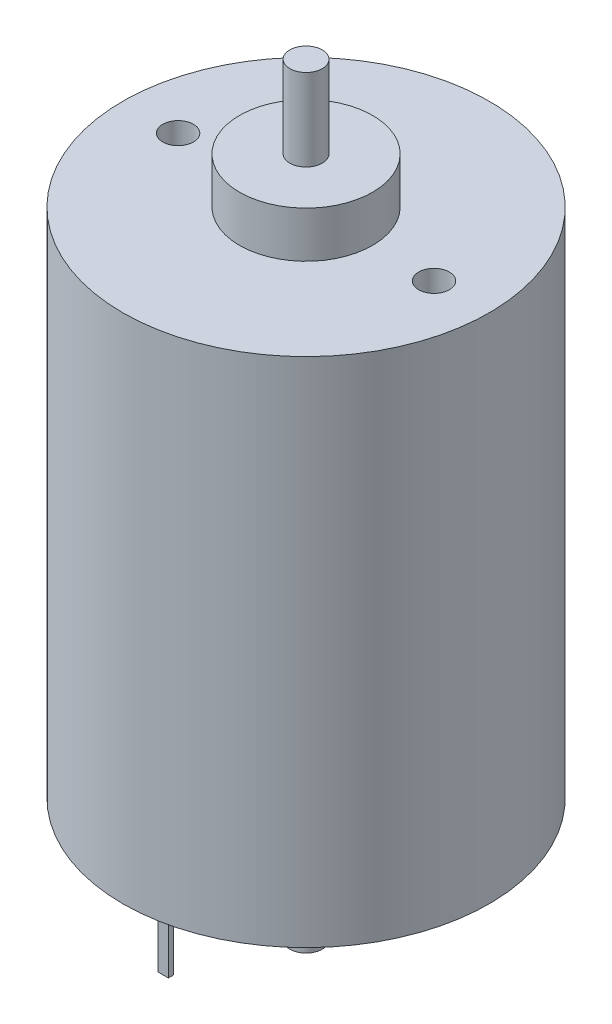
ISO-10303-21;
HEADER;
FILE_DESCRIPTION(('STEP AP214'),'2;1');
FILE_NAME('part.step','',(''),(''),'','','');
FILE_SCHEMA(('AUTOMOTIVE_DESIGN { 1 0 10303 214 1 1 1 1 }'));
ENDSEC;
DATA;
#1=APPLICATION_CONTEXT('core data for automotive mechanical design processes');
#2=APPLICATION_PROTOCOL_DEFINITION('international standard','automotive_design',2000,#1);
#3=PRODUCT_CONTEXT('',#1,'mechanical');
#4=PRODUCT('Part','Part','',(#3));
#5=PRODUCT_RELATED_PRODUCT_CATEGORY('part','',(#4));
#6=PRODUCT_DEFINITION_FORMATION('','',#4);
#7=PRODUCT_DEFINITION_CONTEXT('part definition',#1,'design');
#8=PRODUCT_DEFINITION('design','',#6,#7);
#9=PRODUCT_DEFINITION_SHAPE('','',#8);
#10=(LENGTH_UNIT() NAMED_UNIT(*) SI_UNIT(.MILLI.,.METRE.));
#11=(NAMED_UNIT(*) PLANE_ANGLE_UNIT() SI_UNIT($,.RADIAN.));
#12=(NAMED_UNIT(*) SI_UNIT($,.STERADIAN.) SOLID_ANGLE_UNIT());
#13=UNCERTAINTY_MEASURE_WITH_UNIT(LENGTH_MEASURE(1.E-05),#10,'distance_accuracy_value','');
#14=(GEOMETRIC_REPRESENTATION_CONTEXT(3) GLOBAL_UNCERTAINTY_ASSIGNED_CONTEXT((#13)) GLOBAL_UNIT_ASSIGNED_CONTEXT((#10,
#11,#12)) REPRESENTATION_CONTEXT('',''));
#15=CARTESIAN_POINT('',(0.,0.,0.));
#16=DIRECTION('',(0.,0.,1.));
#17=DIRECTION('',(1.,0.,0.));
#18=AXIS2_PLACEMENT_3D('',#15,#16,#17);
#19=CARTESIAN_POINT('',(0.,-15.5,0.));
#20=DIRECTION('',(0.,1.,0.));
#21=DIRECTION('',(0.,0.,1.));
#22=AXIS2_PLACEMENT_3D('',#19,#20,#21);
#23=CYLINDRICAL_SURFACE('',#22,1.585);
#24=CARTESIAN_POINT('',(0.,-3.,0.));
#25=DIRECTION('',(0.,-1.,0.));
#26=DIRECTION('',(0.,0.,-1.));
#27=AXIS2_PLACEMENT_3D('',#24,#25,#26);
#28=CIRCLE('',#27,1.585);
#29=CARTESIAN_POINT('',(0.,-3.,-1.585));
#30=VERTEX_POINT('',#29);
#31=EDGE_CURVE('E179',#30,#30,#28,.T.);
#32=ORIENTED_EDGE('',*,*,#31,.T.);
#33=EDGE_LOOP('',(#32));
#34=FACE_BOUND('',#33,.T.);
#35=CARTESIAN_POINT('',(0.,-12.,0.));
#36=DIRECTION('',(0.,-1.,0.));
#37=DIRECTION('',(0.,0.,-1.));
#38=AXIS2_PLACEMENT_3D('',#35,#36,#37);
#39=CIRCLE('',#38,1.585);
#40=CARTESIAN_POINT('',(0.,-12.,-1.585));
#41=VERTEX_POINT('',#40);
#42=EDGE_CURVE('E287',#41,#41,#39,.T.);
#43=ORIENTED_EDGE('',*,*,#42,.F.);
#44=EDGE_LOOP('',(#43));
#45=FACE_BOUND('',#44,.T.);
#46=ADVANCED_FACE('F42',(#34,#45),#23,.T.);
#47=CARTESIAN_POINT('',(0.,67.,0.));
#48=DIRECTION('',(0.,-1.,0.));
#49=DIRECTION('',(0.,0.,-1.));
#50=AXIS2_PLACEMENT_3D('',#47,#48,#49);
#51=CYLINDRICAL_SURFACE('',#50,1.585);
#52=CARTESIAN_POINT('',(0.,54.5,0.));
#53=DIRECTION('',(0.,1.,0.));
#54=DIRECTION('',(0.,0.,1.));
#55=AXIS2_PLACEMENT_3D('',#52,#53,#54);
#56=CIRCLE('',#55,1.585);
#57=CARTESIAN_POINT('',(0.,54.5,1.585));
#58=VERTEX_POINT('',#57);
#59=EDGE_CURVE('E185',#58,#58,#56,.T.);
#60=ORIENTED_EDGE('',*,*,#59,.T.);
#61=EDGE_LOOP('',(#60));
#62=FACE_BOUND('',#61,.T.);
#63=CARTESIAN_POINT('',(0.,62.5,0.));
#64=DIRECTION('',(0.,1.,0.));
#65=DIRECTION('',(0.,0.,1.));
#66=AXIS2_PLACEMENT_3D('',#63,#64,#65);
#67=CIRCLE('',#66,1.585);
#68=CARTESIAN_POINT('',(0.,62.5,1.585));
#69=VERTEX_POINT('',#68);
#70=EDGE_CURVE('E283',#69,#69,#67,.T.);
#71=ORIENTED_EDGE('',*,*,#70,.F.);
#72=EDGE_LOOP('',(#71));
#73=FACE_BOUND('',#72,.T.);
#74=ADVANCED_FACE('F203',(#62,#73),#51,.T.);
#75=CARTESIAN_POINT('',(0.,0.,0.));
#76=DIRECTION('',(0.,1.,0.));
#77=DIRECTION('',(0.,0.,1.));
#78=AXIS2_PLACEMENT_3D('',#75,#76,#77);
#79=PLANE('',#78);
#80=DIRECTION('',(0.,0.,-1.));
#81=VECTOR('',#80,1.);
#82=CARTESIAN_POINT('',(0.499999999999986,0.,0.));
#83=LINE('',#82,#81);
#84=CARTESIAN_POINT('',(0.499999999999986,0.,13.95));
#85=VERTEX_POINT('',#84);
#86=CARTESIAN_POINT('',(0.499999999999986,0.,13.45));
#87=VERTEX_POINT('',#86);
#88=EDGE_CURVE('E140',#85,#87,#83,.T.);
#89=ORIENTED_EDGE('',*,*,#88,.T.);
#90=DIRECTION('',(-1.,0.,0.));
#91=VECTOR('',#90,1.);
#92=CARTESIAN_POINT('',(0.,0.,13.45));
#93=LINE('',#92,#91);
#94=CARTESIAN_POINT('',(-0.500000000000014,0.,13.45));
#95=VERTEX_POINT('',#94);
#96=EDGE_CURVE('E113',#87,#95,#93,.T.);
#97=ORIENTED_EDGE('',*,*,#96,.T.);
#98=DIRECTION('',(0.,0.,1.));
#99=VECTOR('',#98,1.);
#100=CARTESIAN_POINT('',(-0.500000000000014,0.,0.));
#101=LINE('',#100,#99);
#102=CARTESIAN_POINT('',(-0.500000000000014,0.,13.95));
#103=VERTEX_POINT('',#102);
#104=EDGE_CURVE('E129',#95,#103,#101,.T.);
#105=ORIENTED_EDGE('',*,*,#104,.T.);
#106=DIRECTION('',(1.,0.,0.));
#107=VECTOR('',#106,1.);
#108=CARTESIAN_POINT('',(0.,0.,13.95));
#109=LINE('',#108,#107);
#110=EDGE_CURVE('E57',#103,#85,#109,.T.);
#111=ORIENTED_EDGE('',*,*,#110,.T.);
#112=EDGE_LOOP('',(#89,#97,#105,#111));
#113=FACE_BOUND('',#112,.T.);
#114=CARTESIAN_POINT('',(0.,0.,0.));
#115=DIRECTION('',(0.,1.,0.));
#116=DIRECTION('',(0.,0.,1.));
#117=AXIS2_PLACEMENT_3D('',#114,#115,#116);
#118=CIRCLE('',#117,17.9);
#119=CARTESIAN_POINT('',(0.,0.,17.9));
#120=VERTEX_POINT('',#119);
#121=EDGE_CURVE('E192',#120,#120,#118,.T.);
#122=ORIENTED_EDGE('',*,*,#121,.F.);
#123=EDGE_LOOP('',(#122));
#124=FACE_BOUND('',#123,.T.);
#125=CARTESIAN_POINT('',(0.,0.,0.));
#126=DIRECTION('',(0.,1.,0.));
#127=DIRECTION('',(0.,0.,1.));
#128=AXIS2_PLACEMENT_3D('',#125,#126,#127);
#129=CIRCLE('',#128,5.1);
#130=CARTESIAN_POINT('',(0.,0.,5.1));
#131=VERTEX_POINT('',#130);
#132=EDGE_CURVE('E11',#131,#131,#129,.F.);
#133=ORIENTED_EDGE('',*,*,#132,.F.);
#134=EDGE_LOOP('',(#133));
#135=FACE_BOUND('',#134,.T.);
#136=DIRECTION('',(-1.,0.,0.));
#137=VECTOR('',#136,1.);
#138=CARTESIAN_POINT('',(0.,0.,-13.45));
#139=LINE('',#138,#137);
#140=CARTESIAN_POINT('',(0.5,0.,-13.45));
#141=VERTEX_POINT('',#140);
#142=CARTESIAN_POINT('',(-0.5,0.,-13.45));
#143=VERTEX_POINT('',#142);
#144=EDGE_CURVE('E118',#141,#143,#139,.T.);
#145=ORIENTED_EDGE('',*,*,#144,.F.);
#146=DIRECTION('',(0.,0.,1.));
#147=VECTOR('',#146,1.);
#148=CARTESIAN_POINT('',(0.5,0.,0.));
#149=LINE('',#148,#147);
#150=CARTESIAN_POINT('',(0.5,0.,-13.95));
#151=VERTEX_POINT('',#150);
#152=EDGE_CURVE('E154',#151,#141,#149,.T.);
#153=ORIENTED_EDGE('',*,*,#152,.F.);
#154=DIRECTION('',(-1.,0.,0.));
#155=VECTOR('',#154,1.);
#156=CARTESIAN_POINT('',(0.,0.,-13.95));
#157=LINE('',#156,#155);
#158=CARTESIAN_POINT('',(-0.5,0.,-13.95));
#159=VERTEX_POINT('',#158);
#160=EDGE_CURVE('E165',#151,#159,#157,.T.);
#161=ORIENTED_EDGE('',*,*,#160,.T.);
#162=DIRECTION('',(0.,0.,-1.));
#163=VECTOR('',#162,1.);
#164=CARTESIAN_POINT('',(-0.5,0.,0.));
#165=LINE('',#164,#163);
#166=EDGE_CURVE('E65',#143,#159,#165,.T.);
#167=ORIENTED_EDGE('',*,*,#166,.F.);
#168=EDGE_LOOP('',(#145,#153,#161,#167));
#169=FACE_BOUND('',#168,.T.);
#170=ADVANCED_FACE('F200',(#113,#124,#135,#169),#79,.F.);
#171=CARTESIAN_POINT('',(0.,50.,0.));
#172=DIRECTION('',(0.,-1.,0.));
#173=DIRECTION('',(0.,0.,-1.));
#174=AXIS2_PLACEMENT_3D('',#171,#172,#173);
#175=CYLINDRICAL_SURFACE('',#174,17.9);
#176=CARTESIAN_POINT('',(0.,50.,0.));
#177=DIRECTION('',(0.,1.,0.));
#178=DIRECTION('',(0.,0.,1.));
#179=AXIS2_PLACEMENT_3D('',#176,#177,#178);
#180=CIRCLE('',#179,17.9);
#181=CARTESIAN_POINT('',(0.,50.,17.9));
#182=VERTEX_POINT('',#181);
#183=EDGE_CURVE('E50',#182,#182,#180,.T.);
#184=ORIENTED_EDGE('',*,*,#183,.F.);
#185=EDGE_LOOP('',(#184));
#186=FACE_BOUND('',#185,.T.);
#187=ORIENTED_EDGE('',*,*,#121,.T.);
#188=EDGE_LOOP('',(#187));
#189=FACE_BOUND('',#188,.T.);
#190=ADVANCED_FACE('F44',(#186,#189),#175,.T.);
#191=CARTESIAN_POINT('',(0.,50.,0.));
#192=DIRECTION('',(0.,1.,0.));
#193=DIRECTION('',(0.,0.,1.));
#194=AXIS2_PLACEMENT_3D('',#191,#192,#193);
#195=PLANE('',#194);
#196=CARTESIAN_POINT('',(-12.5,50.,0.));
#197=DIRECTION('',(0.,1.,0.));
#198=DIRECTION('',(0.,0.,1.));
#199=AXIS2_PLACEMENT_3D('',#196,#197,#198);
#200=CIRCLE('',#199,1.5);
#201=CARTESIAN_POINT('',(-12.5,50.,1.5));
#202=VERTEX_POINT('',#201);
#203=EDGE_CURVE('E267',#202,#202,#200,.T.);
#204=ORIENTED_EDGE('',*,*,#203,.F.);
#205=EDGE_LOOP('',(#204));
#206=FACE_BOUND('',#205,.T.);
#207=CARTESIAN_POINT('',(12.5,50.,0.));
#208=DIRECTION('',(0.,1.,0.));
#209=DIRECTION('',(0.,0.,1.));
#210=AXIS2_PLACEMENT_3D('',#207,#208,#209);
#211=CIRCLE('',#210,1.5);
#212=CARTESIAN_POINT('',(12.5,50.,1.5));
#213=VERTEX_POINT('',#212);
#214=EDGE_CURVE('E271',#213,#213,#211,.T.);
#215=ORIENTED_EDGE('',*,*,#214,.F.);
#216=EDGE_LOOP('',(#215));
#217=FACE_BOUND('',#216,.T.);
#218=CARTESIAN_POINT('',(0.,50.,0.));
#219=DIRECTION('',(0.,1.,0.));
#220=DIRECTION('',(0.,0.,1.));
#221=AXIS2_PLACEMENT_3D('',#218,#219,#220);
#222=CIRCLE('',#221,6.5);
#223=CARTESIAN_POINT('',(0.,50.,6.5));
#224=VERTEX_POINT('',#223);
#225=EDGE_CURVE('E188',#224,#224,#222,.T.);
#226=ORIENTED_EDGE('',*,*,#225,.F.);
#227=EDGE_LOOP('',(#226));
#228=FACE_BOUND('',#227,.T.);
#229=ORIENTED_EDGE('',*,*,#183,.T.);
#230=EDGE_LOOP('',(#229));
#231=FACE_BOUND('',#230,.T.);
#232=ADVANCED_FACE('F256',(#206,#217,#228,#231),#195,.T.);
#233=CARTESIAN_POINT('',(0.,54.5,0.));
#234=DIRECTION('',(0.,-1.,0.));
#235=DIRECTION('',(0.,0.,-1.));
#236=AXIS2_PLACEMENT_3D('',#233,#234,#235);
#237=CYLINDRICAL_SURFACE('',#236,6.5);
#238=CARTESIAN_POINT('',(0.,54.5,0.));
#239=DIRECTION('',(0.,1.,0.));
#240=DIRECTION('',(0.,0.,1.));
#241=AXIS2_PLACEMENT_3D('',#238,#239,#240);
#242=CIRCLE('',#241,6.5);
#243=CARTESIAN_POINT('',(0.,54.5,6.5));
#244=VERTEX_POINT('',#243);
#245=EDGE_CURVE('E189',#244,#244,#242,.T.);
#246=ORIENTED_EDGE('',*,*,#245,.F.);
#247=EDGE_LOOP('',(#246));
#248=FACE_BOUND('',#247,.T.);
#249=ORIENTED_EDGE('',*,*,#225,.T.);
#250=EDGE_LOOP('',(#249));
#251=FACE_BOUND('',#250,.T.);
#252=ADVANCED_FACE('F252',(#248,#251),#237,.T.);
#253=CARTESIAN_POINT('',(0.,54.5,0.));
#254=DIRECTION('',(0.,1.,0.));
#255=DIRECTION('',(0.,0.,1.));
#256=AXIS2_PLACEMENT_3D('',#253,#254,#255);
#257=PLANE('',#256);
#258=ORIENTED_EDGE('',*,*,#59,.F.);
#259=EDGE_LOOP('',(#258));
#260=FACE_BOUND('',#259,.T.);
#261=ORIENTED_EDGE('',*,*,#245,.T.);
#262=EDGE_LOOP('',(#261));
#263=FACE_BOUND('',#262,.T.);
#264=ADVANCED_FACE('F247',(#260,#263),#257,.T.);
#265=CARTESIAN_POINT('',(0.,-3.,0.));
#266=DIRECTION('',(0.,1.,0.));
#267=DIRECTION('',(0.,0.,1.));
#268=AXIS2_PLACEMENT_3D('',#265,#266,#267);
#269=CYLINDRICAL_SURFACE('',#268,5.1);
#270=CARTESIAN_POINT('',(0.,-3.,0.));
#271=DIRECTION('',(0.,-1.,0.));
#272=DIRECTION('',(0.,0.,-1.));
#273=AXIS2_PLACEMENT_3D('',#270,#271,#272);
#274=CIRCLE('',#273,5.1);
#275=CARTESIAN_POINT('',(0.,-3.,-5.1));
#276=VERTEX_POINT('',#275);
#277=EDGE_CURVE('E182',#276,#276,#274,.T.);
#278=ORIENTED_EDGE('',*,*,#277,.F.);
#279=EDGE_LOOP('',(#278));
#280=FACE_BOUND('',#279,.T.);
#281=ORIENTED_EDGE('',*,*,#132,.T.);
#282=EDGE_LOOP('',(#281));
#283=FACE_BOUND('',#282,.T.);
#284=ADVANCED_FACE('F244',(#280,#283),#269,.T.);
#285=CARTESIAN_POINT('',(0.,-3.,0.));
#286=DIRECTION('',(0.,-1.,0.));
#287=DIRECTION('',(0.,0.,-1.));
#288=AXIS2_PLACEMENT_3D('',#285,#286,#287);
#289=PLANE('',#288);
#290=ORIENTED_EDGE('',*,*,#31,.F.);
#291=EDGE_LOOP('',(#290));
#292=FACE_BOUND('',#291,.T.);
#293=ORIENTED_EDGE('',*,*,#277,.T.);
#294=EDGE_LOOP('',(#293));
#295=FACE_BOUND('',#294,.T.);
#296=ADVANCED_FACE('F230',(#292,#295),#289,.T.);
#297=CARTESIAN_POINT('',(0.,-8.,-13.45));
#298=DIRECTION('',(0.,0.,-1.));
#299=DIRECTION('',(-1.,0.,0.));
#300=AXIS2_PLACEMENT_3D('',#297,#298,#299);
#301=PLANE('',#300);
#302=ORIENTED_EDGE('',*,*,#144,.T.);
#303=DIRECTION('',(0.,1.,0.));
#304=VECTOR('',#303,1.);
#305=CARTESIAN_POINT('',(-0.5,-8.,-13.45));
#306=LINE('',#305,#304);
#307=CARTESIAN_POINT('',(-0.5,-8.,-13.45));
#308=VERTEX_POINT('',#307);
#309=EDGE_CURVE('E177',#308,#143,#306,.T.);
#310=ORIENTED_EDGE('',*,*,#309,.F.);
#311=DIRECTION('',(-1.,0.,0.));
#312=VECTOR('',#311,1.);
#313=CARTESIAN_POINT('',(0.,-8.,-13.45));
#314=LINE('',#313,#312);
#315=CARTESIAN_POINT('',(0.5,-8.,-13.45));
#316=VERTEX_POINT('',#315);
#317=EDGE_CURVE('E150',#316,#308,#314,.T.);
#318=ORIENTED_EDGE('',*,*,#317,.F.);
#319=DIRECTION('',(0.,1.,0.));
#320=VECTOR('',#319,1.);
#321=CARTESIAN_POINT('',(0.5,-8.,-13.45));
#322=LINE('',#321,#320);
#323=EDGE_CURVE('E161',#316,#141,#322,.T.);
#324=ORIENTED_EDGE('',*,*,#323,.T.);
#325=EDGE_LOOP('',(#302,#310,#318,#324));
#326=FACE_BOUND('',#325,.T.);
#327=ADVANCED_FACE('F214',(#326),#301,.F.);
#328=CARTESIAN_POINT('',(-0.5,-8.,0.));
#329=DIRECTION('',(1.,0.,0.));
#330=DIRECTION('',(0.,0.,-1.));
#331=AXIS2_PLACEMENT_3D('',#328,#329,#330);
#332=PLANE('',#331);
#333=ORIENTED_EDGE('',*,*,#166,.T.);
#334=DIRECTION('',(0.,1.,0.));
#335=VECTOR('',#334,1.);
#336=CARTESIAN_POINT('',(-0.5,-8.,-13.95));
#337=LINE('',#336,#335);
#338=CARTESIAN_POINT('',(-0.5,-8.,-13.95));
#339=VERTEX_POINT('',#338);
#340=EDGE_CURVE('E174',#339,#159,#337,.T.);
#341=ORIENTED_EDGE('',*,*,#340,.F.);
#342=DIRECTION('',(0.,0.,-1.));
#343=VECTOR('',#342,1.);
#344=CARTESIAN_POINT('',(-0.5,-8.,0.));
#345=LINE('',#344,#343);
#346=EDGE_CURVE('E153',#308,#339,#345,.T.);
#347=ORIENTED_EDGE('',*,*,#346,.F.);
#348=ORIENTED_EDGE('',*,*,#309,.T.);
#349=EDGE_LOOP('',(#333,#341,#347,#348));
#350=FACE_BOUND('',#349,.T.);
#351=ADVANCED_FACE('F222',(#350),#332,.F.);
#352=CARTESIAN_POINT('',(0.,-8.,-13.95));
#353=DIRECTION('',(0.,0.,-1.));
#354=DIRECTION('',(-1.,0.,0.));
#355=AXIS2_PLACEMENT_3D('',#352,#353,#354);
#356=PLANE('',#355);
#357=ORIENTED_EDGE('',*,*,#160,.F.);
#358=DIRECTION('',(0.,1.,0.));
#359=VECTOR('',#358,1.);
#360=CARTESIAN_POINT('',(0.5,-8.,-13.95));
#361=LINE('',#360,#359);
#362=CARTESIAN_POINT('',(0.5,-8.,-13.95));
#363=VERTEX_POINT('',#362);
#364=EDGE_CURVE('E171',#363,#151,#361,.T.);
#365=ORIENTED_EDGE('',*,*,#364,.F.);
#366=DIRECTION('',(-1.,0.,0.));
#367=VECTOR('',#366,1.);
#368=CARTESIAN_POINT('',(0.,-8.,-13.95));
#369=LINE('',#368,#367);
#370=EDGE_CURVE('E156',#363,#339,#369,.T.);
#371=ORIENTED_EDGE('',*,*,#370,.T.);
#372=ORIENTED_EDGE('',*,*,#340,.T.);
#373=EDGE_LOOP('',(#357,#365,#371,#372));
#374=FACE_BOUND('',#373,.T.);
#375=ADVANCED_FACE('F220',(#374),#356,.T.);
#376=CARTESIAN_POINT('',(0.5,-8.,0.));
#377=DIRECTION('',(-1.,0.,0.));
#378=DIRECTION('',(0.,0.,1.));
#379=AXIS2_PLACEMENT_3D('',#376,#377,#378);
#380=PLANE('',#379);
#381=ORIENTED_EDGE('',*,*,#152,.T.);
#382=ORIENTED_EDGE('',*,*,#323,.F.);
#383=DIRECTION('',(0.,0.,1.));
#384=VECTOR('',#383,1.);
#385=CARTESIAN_POINT('',(0.5,-8.,0.));
#386=LINE('',#385,#384);
#387=EDGE_CURVE('E159',#363,#316,#386,.T.);
#388=ORIENTED_EDGE('',*,*,#387,.F.);
#389=ORIENTED_EDGE('',*,*,#364,.T.);
#390=EDGE_LOOP('',(#381,#382,#388,#389));
#391=FACE_BOUND('',#390,.T.);
#392=ADVANCED_FACE('F210',(#391),#380,.F.);
#393=CARTESIAN_POINT('',(0.,-8.,0.));
#394=DIRECTION('',(0.,-1.,0.));
#395=DIRECTION('',(0.,0.,-1.));
#396=AXIS2_PLACEMENT_3D('',#393,#394,#395);
#397=PLANE('',#396);
#398=ORIENTED_EDGE('',*,*,#317,.T.);
#399=ORIENTED_EDGE('',*,*,#346,.T.);
#400=ORIENTED_EDGE('',*,*,#370,.F.);
#401=ORIENTED_EDGE('',*,*,#387,.T.);
#402=EDGE_LOOP('',(#398,#399,#400,#401));
#403=FACE_BOUND('',#402,.T.);
#404=ADVANCED_FACE('F216',(#403),#397,.T.);
#405=CARTESIAN_POINT('',(0.,-8.,13.45));
#406=DIRECTION('',(0.,0.,-1.));
#407=DIRECTION('',(-1.,0.,0.));
#408=AXIS2_PLACEMENT_3D('',#405,#406,#407);
#409=PLANE('',#408);
#410=ORIENTED_EDGE('',*,*,#96,.F.);
#411=DIRECTION('',(0.,1.,0.));
#412=VECTOR('',#411,1.);
#413=CARTESIAN_POINT('',(0.499999999999986,-8.,13.45));
#414=LINE('',#413,#412);
#415=CARTESIAN_POINT('',(0.499999999999986,-8.,13.45));
#416=VERTEX_POINT('',#415);
#417=EDGE_CURVE('E107',#416,#87,#414,.T.);
#418=ORIENTED_EDGE('',*,*,#417,.F.);
#419=DIRECTION('',(-1.,0.,0.));
#420=VECTOR('',#419,1.);
#421=CARTESIAN_POINT('',(0.,-8.,13.45));
#422=LINE('',#421,#420);
#423=CARTESIAN_POINT('',(-0.500000000000014,-8.,13.45));
#424=VERTEX_POINT('',#423);
#425=EDGE_CURVE('E110',#416,#424,#422,.T.);
#426=ORIENTED_EDGE('',*,*,#425,.T.);
#427=DIRECTION('',(0.,1.,0.));
#428=VECTOR('',#427,1.);
#429=CARTESIAN_POINT('',(-0.500000000000014,-8.,13.45));
#430=LINE('',#429,#428);
#431=EDGE_CURVE('E138',#424,#95,#430,.T.);
#432=ORIENTED_EDGE('',*,*,#431,.T.);
#433=EDGE_LOOP('',(#410,#418,#426,#432));
#434=FACE_BOUND('',#433,.T.);
#435=ADVANCED_FACE('F109',(#434),#409,.T.);
#436=CARTESIAN_POINT('',(0.499999999999986,-8.,0.));
#437=DIRECTION('',(1.,0.,0.));
#438=DIRECTION('',(0.,0.,-1.));
#439=AXIS2_PLACEMENT_3D('',#436,#437,#438);
#440=PLANE('',#439);
#441=ORIENTED_EDGE('',*,*,#88,.F.);
#442=DIRECTION('',(0.,1.,0.));
#443=VECTOR('',#442,1.);
#444=CARTESIAN_POINT('',(0.499999999999986,-8.,13.95));
#445=LINE('',#444,#443);
#446=CARTESIAN_POINT('',(0.499999999999986,-8.,13.95));
#447=VERTEX_POINT('',#446);
#448=EDGE_CURVE('E119',#447,#85,#445,.T.);
#449=ORIENTED_EDGE('',*,*,#448,.F.);
#450=DIRECTION('',(0.,0.,-1.));
#451=VECTOR('',#450,1.);
#452=CARTESIAN_POINT('',(0.499999999999986,-8.,0.));
#453=LINE('',#452,#451);
#454=EDGE_CURVE('E125',#447,#416,#453,.T.);
#455=ORIENTED_EDGE('',*,*,#454,.T.);
#456=ORIENTED_EDGE('',*,*,#417,.T.);
#457=EDGE_LOOP('',(#441,#449,#455,#456));
#458=FACE_BOUND('',#457,.T.);
#459=ADVANCED_FACE('F131',(#458),#440,.T.);
#460=CARTESIAN_POINT('',(0.,-8.,13.95));
#461=DIRECTION('',(0.,0.,1.));
#462=DIRECTION('',(1.,0.,0.));
#463=AXIS2_PLACEMENT_3D('',#460,#461,#462);
#464=PLANE('',#463);
#465=ORIENTED_EDGE('',*,*,#110,.F.);
#466=DIRECTION('',(0.,1.,0.));
#467=VECTOR('',#466,1.);
#468=CARTESIAN_POINT('',(-0.500000000000014,-8.,13.95));
#469=LINE('',#468,#467);
#470=CARTESIAN_POINT('',(-0.500000000000014,-8.,13.95));
#471=VERTEX_POINT('',#470);
#472=EDGE_CURVE('E147',#471,#103,#469,.T.);
#473=ORIENTED_EDGE('',*,*,#472,.F.);
#474=DIRECTION('',(1.,0.,0.));
#475=VECTOR('',#474,1.);
#476=CARTESIAN_POINT('',(0.,-8.,13.95));
#477=LINE('',#476,#475);
#478=EDGE_CURVE('E132',#471,#447,#477,.T.);
#479=ORIENTED_EDGE('',*,*,#478,.T.);
#480=ORIENTED_EDGE('',*,*,#448,.T.);
#481=EDGE_LOOP('',(#465,#473,#479,#480));
#482=FACE_BOUND('',#481,.T.);
#483=ADVANCED_FACE('F322',(#482),#464,.T.);
#484=CARTESIAN_POINT('',(-0.500000000000014,-8.,0.));
#485=DIRECTION('',(-1.,0.,0.));
#486=DIRECTION('',(0.,0.,1.));
#487=AXIS2_PLACEMENT_3D('',#484,#485,#486);
#488=PLANE('',#487);
#489=ORIENTED_EDGE('',*,*,#104,.F.);
#490=ORIENTED_EDGE('',*,*,#431,.F.);
#491=DIRECTION('',(0.,0.,1.));
#492=VECTOR('',#491,1.);
#493=CARTESIAN_POINT('',(-0.500000000000014,-8.,0.));
#494=LINE('',#493,#492);
#495=EDGE_CURVE('E128',#424,#471,#494,.T.);
#496=ORIENTED_EDGE('',*,*,#495,.T.);
#497=ORIENTED_EDGE('',*,*,#472,.T.);
#498=EDGE_LOOP('',(#489,#490,#496,#497));
#499=FACE_BOUND('',#498,.T.);
#500=ADVANCED_FACE('F319',(#499),#488,.T.);
#501=CARTESIAN_POINT('',(0.,-8.,0.));
#502=DIRECTION('',(0.,-1.,0.));
#503=DIRECTION('',(0.,0.,-1.));
#504=AXIS2_PLACEMENT_3D('',#501,#502,#503);
#505=PLANE('',#504);
#506=ORIENTED_EDGE('',*,*,#425,.F.);
#507=ORIENTED_EDGE('',*,*,#454,.F.);
#508=ORIENTED_EDGE('',*,*,#478,.F.);
#509=ORIENTED_EDGE('',*,*,#495,.F.);
#510=EDGE_LOOP('',(#506,#507,#508,#509));
#511=FACE_BOUND('',#510,.T.);
#512=ADVANCED_FACE('F123',(#511),#505,.T.);
#513=CARTESIAN_POINT('',(12.5,42.,0.));
#514=DIRECTION('',(0.,1.,0.));
#515=DIRECTION('',(0.,0.,1.));
#516=AXIS2_PLACEMENT_3D('',#513,#514,#515);
#517=CYLINDRICAL_SURFACE('',#516,1.5);
#518=CARTESIAN_POINT('',(12.5,42.,0.));
#519=DIRECTION('',(0.,1.,0.));
#520=DIRECTION('',(0.,0.,1.));
#521=AXIS2_PLACEMENT_3D('',#518,#519,#520);
#522=CIRCLE('',#521,1.5);
#523=CARTESIAN_POINT('',(12.5,42.,1.5));
#524=VERTEX_POINT('',#523);
#525=EDGE_CURVE('E141',#524,#524,#522,.T.);
#526=ORIENTED_EDGE('',*,*,#525,.F.);
#527=EDGE_LOOP('',(#526));
#528=FACE_BOUND('',#527,.T.);
#529=ORIENTED_EDGE('',*,*,#214,.T.);
#530=EDGE_LOOP('',(#529));
#531=FACE_BOUND('',#530,.T.);
#532=ADVANCED_FACE('F312',(#528,#531),#517,.F.);
#533=CARTESIAN_POINT('',(0.,42.,0.));
#534=DIRECTION('',(0.,1.,0.));
#535=DIRECTION('',(0.,0.,1.));
#536=AXIS2_PLACEMENT_3D('',#533,#534,#535);
#537=PLANE('',#536);
#538=ORIENTED_EDGE('',*,*,#525,.T.);
#539=EDGE_LOOP('',(#538));
#540=FACE_BOUND('',#539,.T.);
#541=ADVANCED_FACE('F308',(#540),#537,.T.);
#542=CARTESIAN_POINT('',(-12.5,42.,0.));
#543=DIRECTION('',(0.,1.,0.));
#544=DIRECTION('',(0.,0.,1.));
#545=AXIS2_PLACEMENT_3D('',#542,#543,#544);
#546=CYLINDRICAL_SURFACE('',#545,1.5);
#547=CARTESIAN_POINT('',(-12.5,42.,0.));
#548=DIRECTION('',(0.,1.,0.));
#549=DIRECTION('',(0.,0.,1.));
#550=AXIS2_PLACEMENT_3D('',#547,#548,#549);
#551=CIRCLE('',#550,1.5);
#552=CARTESIAN_POINT('',(-12.5,42.,1.5));
#553=VERTEX_POINT('',#552);
#554=EDGE_CURVE('E277',#553,#553,#551,.T.);
#555=ORIENTED_EDGE('',*,*,#554,.F.);
#556=EDGE_LOOP('',(#555));
#557=FACE_BOUND('',#556,.T.);
#558=ORIENTED_EDGE('',*,*,#203,.T.);
#559=EDGE_LOOP('',(#558));
#560=FACE_BOUND('',#559,.T.);
#561=ADVANCED_FACE('F304',(#557,#560),#546,.F.);
#562=CARTESIAN_POINT('',(0.,42.,0.));
#563=DIRECTION('',(0.,1.,0.));
#564=DIRECTION('',(0.,0.,1.));
#565=AXIS2_PLACEMENT_3D('',#562,#563,#564);
#566=PLANE('',#565);
#567=ORIENTED_EDGE('',*,*,#554,.T.);
#568=EDGE_LOOP('',(#567));
#569=FACE_BOUND('',#568,.T.);
#570=ADVANCED_FACE('F298',(#569),#566,.T.);
#571=CARTESIAN_POINT('',(0.,62.5,0.));
#572=DIRECTION('',(0.,1.,0.));
#573=DIRECTION('',(0.,0.,1.));
#574=AXIS2_PLACEMENT_3D('',#571,#572,#573);
#575=PLANE('',#574);
#576=ORIENTED_EDGE('',*,*,#70,.T.);
#577=EDGE_LOOP('',(#576));
#578=FACE_BOUND('',#577,.T.);
#579=ADVANCED_FACE('F293',(#578),#575,.T.);
#580=CARTESIAN_POINT('',(0.,-12.,0.));
#581=DIRECTION('',(0.,-1.,0.));
#582=DIRECTION('',(0.,0.,-1.));
#583=AXIS2_PLACEMENT_3D('',#580,#581,#582);
#584=PLANE('',#583);
#585=ORIENTED_EDGE('',*,*,#42,.T.);
#586=EDGE_LOOP('',(#585));
#587=FACE_BOUND('',#586,.T.);
#588=ADVANCED_FACE('F291',(#587),#584,.T.);
#589=CLOSED_SHELL('',(#46,#74,#170,#190,#232,#252,#264,#284,#296,#327,#351,#375,#392,#404,#435,
#459,#483,#500,#512,#532,#541,#561,#570,#579,#588));
#590=MANIFOLD_SOLID_BREP('B2',#589);
#591=ADVANCED_BREP_SHAPE_REPRESENTATION('',(#18,#590),#14);
#592=SHAPE_DEFINITION_REPRESENTATION(#9,#591);
ENDSEC;
END-ISO-10303-21;
